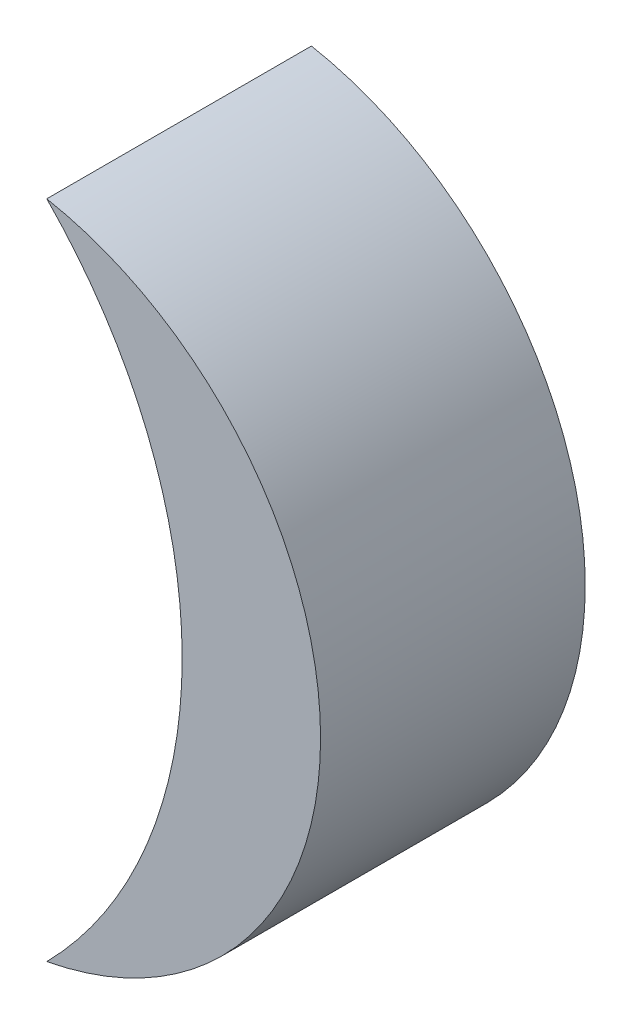
ISO-10303-21;
HEADER;
FILE_DESCRIPTION(('STEP AP214'),'2;1');
FILE_NAME('part.step','',(''),(''),'','','');
FILE_SCHEMA(('AUTOMOTIVE_DESIGN { 1 0 10303 214 1 1 1 1 }'));
ENDSEC;
DATA;
#1=APPLICATION_CONTEXT('core data for automotive mechanical design processes');
#2=APPLICATION_PROTOCOL_DEFINITION('international standard','automotive_design',2000,#1);
#3=PRODUCT_CONTEXT('',#1,'mechanical');
#4=PRODUCT('Part','Part','',(#3));
#5=PRODUCT_RELATED_PRODUCT_CATEGORY('part','',(#4));
#6=PRODUCT_DEFINITION_FORMATION('','',#4);
#7=PRODUCT_DEFINITION_CONTEXT('part definition',#1,'design');
#8=PRODUCT_DEFINITION('design','',#6,#7);
#9=PRODUCT_DEFINITION_SHAPE('','',#8);
#10=(LENGTH_UNIT() NAMED_UNIT(*) SI_UNIT(.MILLI.,.METRE.));
#11=(NAMED_UNIT(*) PLANE_ANGLE_UNIT() SI_UNIT($,.RADIAN.));
#12=(NAMED_UNIT(*) SI_UNIT($,.STERADIAN.) SOLID_ANGLE_UNIT());
#13=UNCERTAINTY_MEASURE_WITH_UNIT(LENGTH_MEASURE(1.E-05),#10,'distance_accuracy_value','');
#14=(GEOMETRIC_REPRESENTATION_CONTEXT(3) GLOBAL_UNCERTAINTY_ASSIGNED_CONTEXT((#13)) GLOBAL_UNIT_ASSIGNED_CONTEXT((#10,
#11,#12)) REPRESENTATION_CONTEXT('',''));
#15=CARTESIAN_POINT('',(0.,0.,0.));
#16=DIRECTION('',(0.,0.,1.));
#17=DIRECTION('',(1.,0.,0.));
#18=AXIS2_PLACEMENT_3D('',#15,#16,#17);
#19=CARTESIAN_POINT('',(136.35019466,69.088,0.));
#20=DIRECTION('',(0.,0.,-1.));
#21=DIRECTION('',(0.,-1.,0.));
#22=AXIS2_PLACEMENT_3D('',#19,#20,#21);
#23=CYLINDRICAL_SURFACE('',#22,0.253999999999995);
#24=CARTESIAN_POINT('',(136.35019466,69.088,0.1999996));
#25=DIRECTION('',(0.,0.,1.));
#26=DIRECTION('',(0.,-1.,0.));
#27=AXIS2_PLACEMENT_3D('',#24,#25,#26);
#28=CIRCLE('',#27,0.253999999999995);
#29=CARTESIAN_POINT('',(136.39728395462,68.8384031283605,0.1999996));
#30=VERTEX_POINT('',#29);
#31=CARTESIAN_POINT('',(136.39728395462,69.3375968716395,0.1999996));
#32=VERTEX_POINT('',#31);
#33=EDGE_CURVE('E11',#30,#32,#28,.T.);
#34=ORIENTED_EDGE('',*,*,#33,.F.);
#35=DIRECTION('',(0.,0.,1.));
#36=VECTOR('',#35,1.);
#37=CARTESIAN_POINT('',(136.39728395462,68.8384031283605,0.));
#38=LINE('',#37,#36);
#39=CARTESIAN_POINT('',(136.39728395462,68.8384031283605,0.));
#40=VERTEX_POINT('',#39);
#41=EDGE_CURVE('E24',#40,#30,#38,.T.);
#42=ORIENTED_EDGE('',*,*,#41,.F.);
#43=CARTESIAN_POINT('',(136.35019466,69.088,0.));
#44=DIRECTION('',(0.,0.,1.));
#45=DIRECTION('',(0.,-1.,0.));
#46=AXIS2_PLACEMENT_3D('',#43,#44,#45);
#47=CIRCLE('',#46,0.253999999999995);
#48=CARTESIAN_POINT('',(136.39728395462,69.3375968716395,0.));
#49=VERTEX_POINT('',#48);
#50=EDGE_CURVE('E66',#40,#49,#47,.T.);
#51=ORIENTED_EDGE('',*,*,#50,.T.);
#52=DIRECTION('',(0.,0.,1.));
#53=VECTOR('',#52,1.);
#54=CARTESIAN_POINT('',(136.39728395462,69.3375968716395,0.));
#55=LINE('',#54,#53);
#56=EDGE_CURVE('E37',#49,#32,#55,.T.);
#57=ORIENTED_EDGE('',*,*,#56,.T.);
#58=EDGE_LOOP('',(#34,#42,#51,#57));
#59=FACE_BOUND('',#58,.T.);
#60=ADVANCED_FACE('F17',(#59),#23,.T.);
#61=CARTESIAN_POINT('',(136.144,69.088,0.));
#62=DIRECTION('',(0.,0.,-1.));
#63=DIRECTION('',(1.,0.,0.));
#64=AXIS2_PLACEMENT_3D('',#61,#62,#63);
#65=CYLINDRICAL_SURFACE('',#64,0.3556);
#66=DIRECTION('',(0.,0.,1.));
#67=VECTOR('',#66,1.);
#68=CARTESIAN_POINT('',(136.4996,69.088,0.));
#69=LINE('',#68,#67);
#70=CARTESIAN_POINT('',(136.4996,69.088,0.));
#71=VERTEX_POINT('',#70);
#72=CARTESIAN_POINT('',(136.4996,69.088,0.1999996));
#73=VERTEX_POINT('',#72);
#74=EDGE_CURVE('E47',#71,#73,#69,.T.);
#75=ORIENTED_EDGE('',*,*,#74,.T.);
#76=CARTESIAN_POINT('',(136.144,69.088,0.1999996));
#77=DIRECTION('',(0.,0.,1.));
#78=DIRECTION('',(1.,0.,0.));
#79=AXIS2_PLACEMENT_3D('',#76,#77,#78);
#80=CIRCLE('',#79,0.3556);
#81=EDGE_CURVE('E57',#73,#32,#80,.T.);
#82=ORIENTED_EDGE('',*,*,#81,.T.);
#83=ORIENTED_EDGE('',*,*,#56,.F.);
#84=CARTESIAN_POINT('',(136.144,69.088,0.));
#85=DIRECTION('',(0.,0.,1.));
#86=DIRECTION('',(1.,0.,0.));
#87=AXIS2_PLACEMENT_3D('',#84,#85,#86);
#88=CIRCLE('',#87,0.3556);
#89=EDGE_CURVE('E60',#71,#49,#88,.T.);
#90=ORIENTED_EDGE('',*,*,#89,.F.);
#91=EDGE_LOOP('',(#75,#82,#83,#90));
#92=FACE_BOUND('',#91,.T.);
#93=ADVANCED_FACE('F61',(#92),#65,.F.);
#94=CARTESIAN_POINT('',(136.144,69.088,0.));
#95=DIRECTION('',(0.,0.,-1.));
#96=DIRECTION('',(1.,0.,0.));
#97=AXIS2_PLACEMENT_3D('',#94,#95,#96);
#98=CYLINDRICAL_SURFACE('',#97,0.3556);
#99=ORIENTED_EDGE('',*,*,#41,.T.);
#100=CARTESIAN_POINT('',(136.144,69.088,0.1999996));
#101=DIRECTION('',(0.,0.,1.));
#102=DIRECTION('',(1.,0.,0.));
#103=AXIS2_PLACEMENT_3D('',#100,#101,#102);
#104=CIRCLE('',#103,0.3556);
#105=EDGE_CURVE('E53',#30,#73,#104,.T.);
#106=ORIENTED_EDGE('',*,*,#105,.T.);
#107=ORIENTED_EDGE('',*,*,#74,.F.);
#108=EDGE_CURVE('E51',#40,#71,#88,.T.);
#109=ORIENTED_EDGE('',*,*,#108,.F.);
#110=EDGE_LOOP('',(#99,#106,#107,#109));
#111=FACE_BOUND('',#110,.T.);
#112=ADVANCED_FACE('F49',(#111),#98,.F.);
#113=CARTESIAN_POINT('',(136.144,68.834,0.));
#114=DIRECTION('',(0.,0.,-1.));
#115=DIRECTION('',(-1.,0.,0.));
#116=AXIS2_PLACEMENT_3D('',#113,#114,#115);
#117=PLANE('',#116);
#118=ORIENTED_EDGE('',*,*,#50,.F.);
#119=ORIENTED_EDGE('',*,*,#108,.T.);
#120=ORIENTED_EDGE('',*,*,#89,.T.);
#121=EDGE_LOOP('',(#118,#119,#120));
#122=FACE_BOUND('',#121,.T.);
#123=ADVANCED_FACE('F65',(#122),#117,.T.);
#124=CARTESIAN_POINT('',(136.144,68.834,0.1999996));
#125=DIRECTION('',(0.,0.,-1.));
#126=DIRECTION('',(-1.,0.,0.));
#127=AXIS2_PLACEMENT_3D('',#124,#125,#126);
#128=PLANE('',#127);
#129=ORIENTED_EDGE('',*,*,#105,.F.);
#130=ORIENTED_EDGE('',*,*,#33,.T.);
#131=ORIENTED_EDGE('',*,*,#81,.F.);
#132=EDGE_LOOP('',(#129,#130,#131));
#133=FACE_BOUND('',#132,.T.);
#134=ADVANCED_FACE('F72',(#133),#128,.F.);
#135=CLOSED_SHELL('',(#60,#93,#112,#123,#134));
#136=MANIFOLD_SOLID_BREP('B1',#135);
#137=ADVANCED_BREP_SHAPE_REPRESENTATION('',(#18,#136),#14);
#138=SHAPE_DEFINITION_REPRESENTATION(#9,#137);
ENDSEC;
END-ISO-10303-21;
